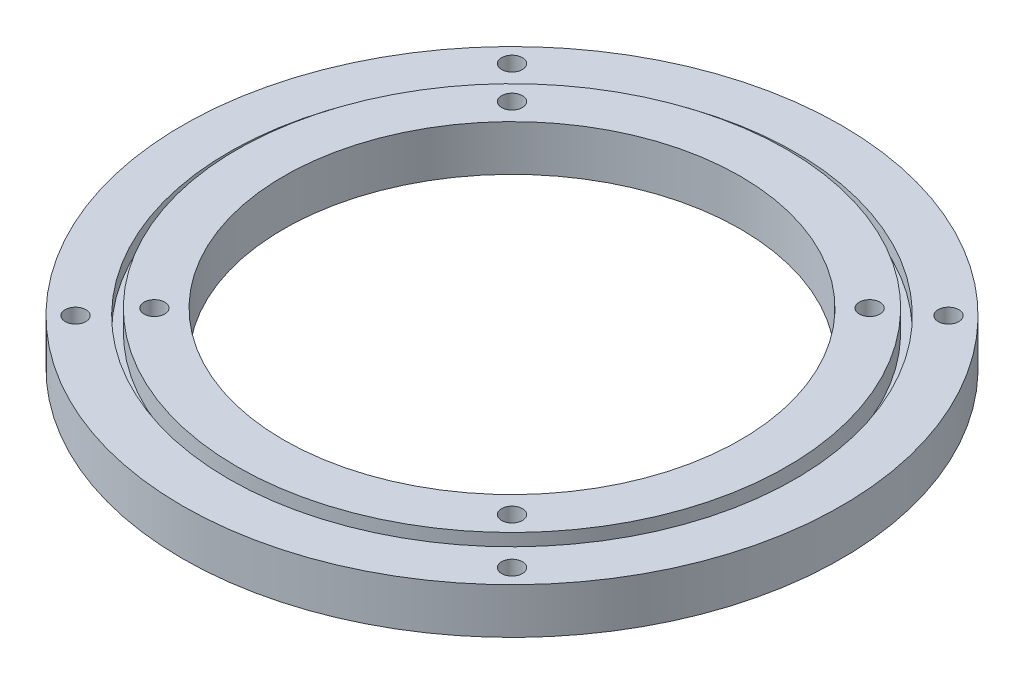
ISO-10303-21;
HEADER;
FILE_DESCRIPTION(('STEP AP214'),'2;1');
FILE_NAME('part.step','',(''),(''),'','','');
FILE_SCHEMA(('AUTOMOTIVE_DESIGN { 1 0 10303 214 1 1 1 1 }'));
ENDSEC;
DATA;
#1=APPLICATION_CONTEXT('core data for automotive mechanical design processes');
#2=APPLICATION_PROTOCOL_DEFINITION('international standard','automotive_design',2000,#1);
#3=PRODUCT_CONTEXT('',#1,'mechanical');
#4=PRODUCT('Part','Part','',(#3));
#5=PRODUCT_RELATED_PRODUCT_CATEGORY('part','',(#4));
#6=PRODUCT_DEFINITION_FORMATION('','',#4);
#7=PRODUCT_DEFINITION_CONTEXT('part definition',#1,'design');
#8=PRODUCT_DEFINITION('design','',#6,#7);
#9=PRODUCT_DEFINITION_SHAPE('','',#8);
#10=(LENGTH_UNIT() NAMED_UNIT(*) SI_UNIT(.MILLI.,.METRE.));
#11=(NAMED_UNIT(*) PLANE_ANGLE_UNIT() SI_UNIT($,.RADIAN.));
#12=(NAMED_UNIT(*) SI_UNIT($,.STERADIAN.) SOLID_ANGLE_UNIT());
#13=UNCERTAINTY_MEASURE_WITH_UNIT(LENGTH_MEASURE(1.E-05),#10,'distance_accuracy_value','');
#14=(GEOMETRIC_REPRESENTATION_CONTEXT(3) GLOBAL_UNCERTAINTY_ASSIGNED_CONTEXT((#13)) GLOBAL_UNIT_ASSIGNED_CONTEXT((#10,
#11,#12)) REPRESENTATION_CONTEXT('',''));
#15=CARTESIAN_POINT('',(0.,0.,0.));
#16=DIRECTION('',(0.,0.,1.));
#17=DIRECTION('',(1.,0.,0.));
#18=AXIS2_PLACEMENT_3D('',#15,#16,#17);
#19=CARTESIAN_POINT('',(0.,6.,0.));
#20=DIRECTION('',(0.,-1.,0.));
#21=DIRECTION('',(0.,0.,-1.));
#22=AXIS2_PLACEMENT_3D('',#19,#20,#21);
#23=CYLINDRICAL_SURFACE('',#22,86.77);
#24=CARTESIAN_POINT('',(0.,-1.5875,0.));
#25=DIRECTION('',(0.,1.,0.));
#26=DIRECTION('',(0.,0.,1.));
#27=AXIS2_PLACEMENT_3D('',#24,#25,#26);
#28=CIRCLE('',#27,86.77);
#29=CARTESIAN_POINT('',(0.,-1.5875,86.77));
#30=VERTEX_POINT('',#29);
#31=EDGE_CURVE('E177',#30,#30,#28,.T.);
#32=ORIENTED_EDGE('',*,*,#31,.T.);
#33=EDGE_LOOP('',(#32));
#34=FACE_BOUND('',#33,.T.);
#35=CARTESIAN_POINT('',(0.,-8.,0.));
#36=DIRECTION('',(0.,1.,0.));
#37=DIRECTION('',(0.,0.,1.));
#38=AXIS2_PLACEMENT_3D('',#35,#36,#37);
#39=CIRCLE('',#38,86.77);
#40=CARTESIAN_POINT('',(0.,-8.,86.77));
#41=VERTEX_POINT('',#40);
#42=EDGE_CURVE('E224',#41,#41,#39,.T.);
#43=ORIENTED_EDGE('',*,*,#42,.F.);
#44=EDGE_LOOP('',(#43));
#45=FACE_BOUND('',#44,.T.);
#46=ADVANCED_FACE('F147',(#34,#45),#23,.F.);
#47=CARTESIAN_POINT('',(66.8887659663411,6.,66.8887659663418));
#48=DIRECTION('',(0.,-1.,0.));
#49=DIRECTION('',(0.,0.,-1.));
#50=AXIS2_PLACEMENT_3D('',#47,#48,#49);
#51=CYLINDRICAL_SURFACE('',#50,3.175);
#52=CARTESIAN_POINT('',(66.8887659663411,6.,66.8887659663418));
#53=DIRECTION('',(0.,1.,0.));
#54=DIRECTION('',(0.,0.,1.));
#55=AXIS2_PLACEMENT_3D('',#52,#53,#54);
#56=CIRCLE('',#55,3.175);
#57=CARTESIAN_POINT('',(66.8887659663411,6.,70.0637659663418));
#58=VERTEX_POINT('',#57);
#59=EDGE_CURVE('E158',#58,#58,#56,.F.);
#60=ORIENTED_EDGE('',*,*,#59,.F.);
#61=EDGE_LOOP('',(#60));
#62=FACE_BOUND('',#61,.T.);
#63=CARTESIAN_POINT('',(66.8887659663411,-8.,66.8887659663418));
#64=DIRECTION('',(0.,1.,0.));
#65=DIRECTION('',(0.,0.,1.));
#66=AXIS2_PLACEMENT_3D('',#63,#64,#65);
#67=CIRCLE('',#66,3.175);
#68=CARTESIAN_POINT('',(66.8887659663411,-8.,70.0637659663418));
#69=VERTEX_POINT('',#68);
#70=EDGE_CURVE('E227',#69,#69,#67,.T.);
#71=ORIENTED_EDGE('',*,*,#70,.F.);
#72=EDGE_LOOP('',(#71));
#73=FACE_BOUND('',#72,.T.);
#74=ADVANCED_FACE('F259',(#62,#73),#51,.F.);
#75=CARTESIAN_POINT('',(0.,6.,0.));
#76=DIRECTION('',(0.,-1.,0.));
#77=DIRECTION('',(0.,0.,-1.));
#78=AXIS2_PLACEMENT_3D('',#75,#76,#77);
#79=CYLINDRICAL_SURFACE('',#78,101.);
#80=CARTESIAN_POINT('',(0.,6.,0.));
#81=DIRECTION('',(0.,1.,0.));
#82=DIRECTION('',(0.,0.,1.));
#83=AXIS2_PLACEMENT_3D('',#80,#81,#82);
#84=CIRCLE('',#83,101.);
#85=CARTESIAN_POINT('',(0.,6.,101.));
#86=VERTEX_POINT('',#85);
#87=EDGE_CURVE('E162',#86,#86,#84,.T.);
#88=ORIENTED_EDGE('',*,*,#87,.F.);
#89=EDGE_LOOP('',(#88));
#90=FACE_BOUND('',#89,.T.);
#91=CARTESIAN_POINT('',(0.,-8.,0.));
#92=DIRECTION('',(0.,1.,0.));
#93=DIRECTION('',(0.,0.,1.));
#94=AXIS2_PLACEMENT_3D('',#91,#92,#93);
#95=CIRCLE('',#94,101.);
#96=CARTESIAN_POINT('',(0.,-8.,101.));
#97=VERTEX_POINT('',#96);
#98=EDGE_CURVE('E221',#97,#97,#95,.T.);
#99=ORIENTED_EDGE('',*,*,#98,.T.);
#100=EDGE_LOOP('',(#99));
#101=FACE_BOUND('',#100,.T.);
#102=ADVANCED_FACE('F266',(#90,#101),#79,.T.);
#103=CARTESIAN_POINT('',(0.,1.5875,0.));
#104=DIRECTION('',(0.,1.,0.));
#105=DIRECTION('',(0.,0.,1.));
#106=AXIS2_PLACEMENT_3D('',#103,#104,#105);
#107=CIRCLE('',#106,86.77);
#108=CARTESIAN_POINT('',(0.,1.5875,86.77));
#109=VERTEX_POINT('',#108);
#110=EDGE_CURVE('E11',#109,#109,#107,.T.);
#111=ORIENTED_EDGE('',*,*,#110,.F.);
#112=EDGE_LOOP('',(#111));
#113=FACE_BOUND('',#112,.T.);
#114=CARTESIAN_POINT('',(0.,6.,0.));
#115=DIRECTION('',(0.,1.,0.));
#116=DIRECTION('',(0.,0.,1.));
#117=AXIS2_PLACEMENT_3D('',#114,#115,#116);
#118=CIRCLE('',#117,86.77);
#119=CARTESIAN_POINT('',(0.,6.,86.77));
#120=VERTEX_POINT('',#119);
#121=EDGE_CURVE('E167',#120,#120,#118,.T.);
#122=ORIENTED_EDGE('',*,*,#121,.T.);
#123=EDGE_LOOP('',(#122));
#124=FACE_BOUND('',#123,.T.);
#125=ADVANCED_FACE('F262',(#113,#124),#23,.F.);
#126=CARTESIAN_POINT('',(66.8887659663418,6.,-66.8887659663411));
#127=DIRECTION('',(0.,-1.,0.));
#128=DIRECTION('',(0.,0.,-1.));
#129=AXIS2_PLACEMENT_3D('',#126,#127,#128);
#130=CYLINDRICAL_SURFACE('',#129,3.175);
#131=CARTESIAN_POINT('',(66.8887659663418,6.,-66.8887659663411));
#132=DIRECTION('',(0.,1.,0.));
#133=DIRECTION('',(0.,0.,1.));
#134=AXIS2_PLACEMENT_3D('',#131,#132,#133);
#135=CIRCLE('',#134,3.175);
#136=CARTESIAN_POINT('',(66.8887659663418,6.,-63.7137659663411));
#137=VERTEX_POINT('',#136);
#138=EDGE_CURVE('E170',#137,#137,#135,.F.);
#139=ORIENTED_EDGE('',*,*,#138,.F.);
#140=EDGE_LOOP('',(#139));
#141=FACE_BOUND('',#140,.T.);
#142=CARTESIAN_POINT('',(66.8887659663418,-8.,-66.8887659663411));
#143=DIRECTION('',(0.,1.,0.));
#144=DIRECTION('',(0.,0.,1.));
#145=AXIS2_PLACEMENT_3D('',#142,#143,#144);
#146=CIRCLE('',#145,3.175);
#147=CARTESIAN_POINT('',(66.8887659663418,-8.,-63.7137659663411));
#148=VERTEX_POINT('',#147);
#149=EDGE_CURVE('E230',#148,#148,#146,.T.);
#150=ORIENTED_EDGE('',*,*,#149,.F.);
#151=EDGE_LOOP('',(#150));
#152=FACE_BOUND('',#151,.T.);
#153=ADVANCED_FACE('F255',(#141,#152),#130,.F.);
#154=CARTESIAN_POINT('',(-66.8887659663418,6.,66.8887659663411));
#155=DIRECTION('',(0.,-1.,0.));
#156=DIRECTION('',(0.,0.,-1.));
#157=AXIS2_PLACEMENT_3D('',#154,#155,#156);
#158=CYLINDRICAL_SURFACE('',#157,3.175);
#159=CARTESIAN_POINT('',(-66.8887659663418,6.,66.8887659663411));
#160=DIRECTION('',(0.,1.,0.));
#161=DIRECTION('',(0.,0.,1.));
#162=AXIS2_PLACEMENT_3D('',#159,#160,#161);
#163=CIRCLE('',#162,3.175);
#164=CARTESIAN_POINT('',(-66.8887659663418,6.,70.0637659663411));
#165=VERTEX_POINT('',#164);
#166=EDGE_CURVE('E173',#165,#165,#163,.F.);
#167=ORIENTED_EDGE('',*,*,#166,.F.);
#168=EDGE_LOOP('',(#167));
#169=FACE_BOUND('',#168,.T.);
#170=CARTESIAN_POINT('',(-66.8887659663418,-8.,66.8887659663411));
#171=DIRECTION('',(0.,1.,0.));
#172=DIRECTION('',(0.,0.,1.));
#173=AXIS2_PLACEMENT_3D('',#170,#171,#172);
#174=CIRCLE('',#173,3.175);
#175=CARTESIAN_POINT('',(-66.8887659663418,-8.,70.0637659663411));
#176=VERTEX_POINT('',#175);
#177=EDGE_CURVE('E233',#176,#176,#174,.T.);
#178=ORIENTED_EDGE('',*,*,#177,.F.);
#179=EDGE_LOOP('',(#178));
#180=FACE_BOUND('',#179,.T.);
#181=ADVANCED_FACE('F149',(#169,#180),#158,.F.);
#182=CARTESIAN_POINT('',(-66.8887659663411,6.,-66.8887659663418));
#183=DIRECTION('',(0.,-1.,0.));
#184=DIRECTION('',(0.,0.,-1.));
#185=AXIS2_PLACEMENT_3D('',#182,#183,#184);
#186=CYLINDRICAL_SURFACE('',#185,3.175);
#187=CARTESIAN_POINT('',(-66.8887659663411,6.,-66.8887659663418));
#188=DIRECTION('',(0.,1.,0.));
#189=DIRECTION('',(0.,0.,1.));
#190=AXIS2_PLACEMENT_3D('',#187,#188,#189);
#191=CIRCLE('',#190,3.175);
#192=CARTESIAN_POINT('',(-66.8887659663411,6.,-63.7137659663418));
#193=VERTEX_POINT('',#192);
#194=EDGE_CURVE('E154',#193,#193,#191,.F.);
#195=ORIENTED_EDGE('',*,*,#194,.F.);
#196=EDGE_LOOP('',(#195));
#197=FACE_BOUND('',#196,.T.);
#198=CARTESIAN_POINT('',(-66.8887659663411,-8.,-66.8887659663418));
#199=DIRECTION('',(0.,1.,0.));
#200=DIRECTION('',(0.,0.,1.));
#201=AXIS2_PLACEMENT_3D('',#198,#199,#200);
#202=CIRCLE('',#201,3.175);
#203=CARTESIAN_POINT('',(-66.8887659663411,-8.,-63.7137659663418));
#204=VERTEX_POINT('',#203);
#205=EDGE_CURVE('E236',#204,#204,#202,.T.);
#206=ORIENTED_EDGE('',*,*,#205,.F.);
#207=EDGE_LOOP('',(#206));
#208=FACE_BOUND('',#207,.T.);
#209=ADVANCED_FACE('F243',(#197,#208),#186,.F.);
#210=CARTESIAN_POINT('',(0.,6.,0.));
#211=DIRECTION('',(0.,1.,0.));
#212=DIRECTION('',(0.,0.,1.));
#213=AXIS2_PLACEMENT_3D('',#210,#211,#212);
#214=PLANE('',#213);
#215=ORIENTED_EDGE('',*,*,#166,.T.);
#216=EDGE_LOOP('',(#215));
#217=FACE_BOUND('',#216,.T.);
#218=ORIENTED_EDGE('',*,*,#138,.T.);
#219=EDGE_LOOP('',(#218));
#220=FACE_BOUND('',#219,.T.);
#221=ORIENTED_EDGE('',*,*,#121,.F.);
#222=EDGE_LOOP('',(#221));
#223=FACE_BOUND('',#222,.T.);
#224=ORIENTED_EDGE('',*,*,#87,.T.);
#225=EDGE_LOOP('',(#224));
#226=FACE_BOUND('',#225,.T.);
#227=ORIENTED_EDGE('',*,*,#59,.T.);
#228=EDGE_LOOP('',(#227));
#229=FACE_BOUND('',#228,.T.);
#230=ORIENTED_EDGE('',*,*,#194,.T.);
#231=EDGE_LOOP('',(#230));
#232=FACE_BOUND('',#231,.T.);
#233=ADVANCED_FACE('F245',(#217,#220,#223,#226,#229,#232),#214,.T.);
#234=CARTESIAN_POINT('',(0.,1.5875,0.));
#235=DIRECTION('',(0.,1.,0.));
#236=DIRECTION('',(0.,0.,1.));
#237=AXIS2_PLACEMENT_3D('',#234,#235,#236);
#238=PLANE('',#237);
#239=CARTESIAN_POINT('',(0.,1.5875,0.));
#240=DIRECTION('',(0.,1.,0.));
#241=DIRECTION('',(0.,0.,1.));
#242=AXIS2_PLACEMENT_3D('',#239,#240,#241);
#243=CIRCLE('',#242,84.23);
#244=CARTESIAN_POINT('',(0.,1.5875,84.23));
#245=VERTEX_POINT('',#244);
#246=EDGE_CURVE('E176',#245,#245,#243,.T.);
#247=ORIENTED_EDGE('',*,*,#246,.F.);
#248=EDGE_LOOP('',(#247));
#249=FACE_BOUND('',#248,.T.);
#250=ORIENTED_EDGE('',*,*,#110,.T.);
#251=EDGE_LOOP('',(#250));
#252=FACE_BOUND('',#251,.T.);
#253=ADVANCED_FACE('F252',(#249,#252),#238,.T.);
#254=CARTESIAN_POINT('',(0.,-1.5875,0.));
#255=DIRECTION('',(0.,1.,0.));
#256=DIRECTION('',(0.,0.,1.));
#257=AXIS2_PLACEMENT_3D('',#254,#255,#256);
#258=PLANE('',#257);
#259=CARTESIAN_POINT('',(0.,-1.5875,0.));
#260=DIRECTION('',(0.,1.,0.));
#261=DIRECTION('',(0.,0.,1.));
#262=AXIS2_PLACEMENT_3D('',#259,#260,#261);
#263=CIRCLE('',#262,84.23);
#264=CARTESIAN_POINT('',(0.,-1.5875,84.23));
#265=VERTEX_POINT('',#264);
#266=EDGE_CURVE('E180',#265,#265,#263,.F.);
#267=ORIENTED_EDGE('',*,*,#266,.F.);
#268=EDGE_LOOP('',(#267));
#269=FACE_BOUND('',#268,.T.);
#270=ORIENTED_EDGE('',*,*,#31,.F.);
#271=EDGE_LOOP('',(#270));
#272=FACE_BOUND('',#271,.T.);
#273=ADVANCED_FACE('F333',(#269,#272),#258,.F.);
#274=CARTESIAN_POINT('',(0.,6.,0.));
#275=DIRECTION('',(0.,-1.,0.));
#276=DIRECTION('',(0.,0.,-1.));
#277=AXIS2_PLACEMENT_3D('',#274,#275,#276);
#278=CYLINDRICAL_SURFACE('',#277,84.23);
#279=CARTESIAN_POINT('',(0.,-6.,0.));
#280=DIRECTION('',(0.,1.,0.));
#281=DIRECTION('',(0.,0.,1.));
#282=AXIS2_PLACEMENT_3D('',#279,#280,#281);
#283=CIRCLE('',#282,84.23);
#284=CARTESIAN_POINT('',(0.,-6.,84.23));
#285=VERTEX_POINT('',#284);
#286=EDGE_CURVE('E185',#285,#285,#283,.T.);
#287=ORIENTED_EDGE('',*,*,#286,.T.);
#288=EDGE_LOOP('',(#287));
#289=FACE_BOUND('',#288,.T.);
#290=ORIENTED_EDGE('',*,*,#266,.T.);
#291=EDGE_LOOP('',(#290));
#292=FACE_BOUND('',#291,.T.);
#293=ADVANCED_FACE('F311',(#289,#292),#278,.T.);
#294=CARTESIAN_POINT('',(0.,6.,0.));
#295=DIRECTION('',(0.,-1.,0.));
#296=DIRECTION('',(0.,0.,-1.));
#297=AXIS2_PLACEMENT_3D('',#294,#295,#296);
#298=CYLINDRICAL_SURFACE('',#297,70.);
#299=CARTESIAN_POINT('',(0.,-6.,0.));
#300=DIRECTION('',(0.,1.,0.));
#301=DIRECTION('',(0.,0.,1.));
#302=AXIS2_PLACEMENT_3D('',#299,#300,#301);
#303=CIRCLE('',#302,70.);
#304=CARTESIAN_POINT('',(0.,-6.,70.));
#305=VERTEX_POINT('',#304);
#306=EDGE_CURVE('E188',#305,#305,#303,.T.);
#307=ORIENTED_EDGE('',*,*,#306,.F.);
#308=EDGE_LOOP('',(#307));
#309=FACE_BOUND('',#308,.T.);
#310=CARTESIAN_POINT('',(0.,8.,0.));
#311=DIRECTION('',(0.,1.,0.));
#312=DIRECTION('',(0.,0.,1.));
#313=AXIS2_PLACEMENT_3D('',#310,#311,#312);
#314=CIRCLE('',#313,70.);
#315=CARTESIAN_POINT('',(0.,8.,70.));
#316=VERTEX_POINT('',#315);
#317=EDGE_CURVE('E206',#316,#316,#314,.T.);
#318=ORIENTED_EDGE('',*,*,#317,.T.);
#319=EDGE_LOOP('',(#318));
#320=FACE_BOUND('',#319,.T.);
#321=ADVANCED_FACE('F312',(#309,#320),#298,.F.);
#322=CARTESIAN_POINT('',(54.8007755419577,6.,-54.8007755419572));
#323=DIRECTION('',(0.,-1.,0.));
#324=DIRECTION('',(0.,0.,-1.));
#325=AXIS2_PLACEMENT_3D('',#322,#323,#324);
#326=CYLINDRICAL_SURFACE('',#325,3.175);
#327=CARTESIAN_POINT('',(54.8007755419577,-6.,-54.8007755419572));
#328=DIRECTION('',(0.,1.,0.));
#329=DIRECTION('',(0.,0.,1.));
#330=AXIS2_PLACEMENT_3D('',#327,#328,#329);
#331=CIRCLE('',#330,3.175);
#332=CARTESIAN_POINT('',(54.8007755419577,-6.,-51.6257755419572));
#333=VERTEX_POINT('',#332);
#334=EDGE_CURVE('E191',#333,#333,#331,.T.);
#335=ORIENTED_EDGE('',*,*,#334,.F.);
#336=EDGE_LOOP('',(#335));
#337=FACE_BOUND('',#336,.T.);
#338=CARTESIAN_POINT('',(54.8007755419577,8.,-54.8007755419572));
#339=DIRECTION('',(0.,1.,0.));
#340=DIRECTION('',(0.,0.,1.));
#341=AXIS2_PLACEMENT_3D('',#338,#339,#340);
#342=CIRCLE('',#341,3.175);
#343=CARTESIAN_POINT('',(54.8007755419577,8.,-51.6257755419572));
#344=VERTEX_POINT('',#343);
#345=EDGE_CURVE('E209',#344,#344,#342,.T.);
#346=ORIENTED_EDGE('',*,*,#345,.T.);
#347=EDGE_LOOP('',(#346));
#348=FACE_BOUND('',#347,.T.);
#349=ADVANCED_FACE('F315',(#337,#348),#326,.F.);
#350=CARTESIAN_POINT('',(54.8007755419572,6.,54.8007755419577));
#351=DIRECTION('',(0.,-1.,0.));
#352=DIRECTION('',(0.,0.,-1.));
#353=AXIS2_PLACEMENT_3D('',#350,#351,#352);
#354=CYLINDRICAL_SURFACE('',#353,3.17499999999999);
#355=CARTESIAN_POINT('',(54.8007755419572,-6.,54.8007755419577));
#356=DIRECTION('',(0.,1.,0.));
#357=DIRECTION('',(0.,0.,1.));
#358=AXIS2_PLACEMENT_3D('',#355,#356,#357);
#359=CIRCLE('',#358,3.17499999999999);
#360=CARTESIAN_POINT('',(54.8007755419572,-6.,57.9757755419577));
#361=VERTEX_POINT('',#360);
#362=EDGE_CURVE('E194',#361,#361,#359,.T.);
#363=ORIENTED_EDGE('',*,*,#362,.F.);
#364=EDGE_LOOP('',(#363));
#365=FACE_BOUND('',#364,.T.);
#366=CARTESIAN_POINT('',(54.8007755419572,8.,54.8007755419577));
#367=DIRECTION('',(0.,1.,0.));
#368=DIRECTION('',(0.,0.,1.));
#369=AXIS2_PLACEMENT_3D('',#366,#367,#368);
#370=CIRCLE('',#369,3.17499999999999);
#371=CARTESIAN_POINT('',(54.8007755419572,8.,57.9757755419577));
#372=VERTEX_POINT('',#371);
#373=EDGE_CURVE('E212',#372,#372,#370,.T.);
#374=ORIENTED_EDGE('',*,*,#373,.T.);
#375=EDGE_LOOP('',(#374));
#376=FACE_BOUND('',#375,.T.);
#377=ADVANCED_FACE('F319',(#365,#376),#354,.F.);
#378=CARTESIAN_POINT('',(-54.8007755419577,6.,54.8007755419572));
#379=DIRECTION('',(0.,-1.,0.));
#380=DIRECTION('',(0.,0.,-1.));
#381=AXIS2_PLACEMENT_3D('',#378,#379,#380);
#382=CYLINDRICAL_SURFACE('',#381,3.175);
#383=CARTESIAN_POINT('',(-54.8007755419577,-6.,54.8007755419572));
#384=DIRECTION('',(0.,1.,0.));
#385=DIRECTION('',(0.,0.,1.));
#386=AXIS2_PLACEMENT_3D('',#383,#384,#385);
#387=CIRCLE('',#386,3.175);
#388=CARTESIAN_POINT('',(-54.8007755419577,-6.,57.9757755419572));
#389=VERTEX_POINT('',#388);
#390=EDGE_CURVE('E197',#389,#389,#387,.T.);
#391=ORIENTED_EDGE('',*,*,#390,.F.);
#392=EDGE_LOOP('',(#391));
#393=FACE_BOUND('',#392,.T.);
#394=CARTESIAN_POINT('',(-54.8007755419577,8.,54.8007755419572));
#395=DIRECTION('',(0.,1.,0.));
#396=DIRECTION('',(0.,0.,1.));
#397=AXIS2_PLACEMENT_3D('',#394,#395,#396);
#398=CIRCLE('',#397,3.175);
#399=CARTESIAN_POINT('',(-54.8007755419577,8.,57.9757755419572));
#400=VERTEX_POINT('',#399);
#401=EDGE_CURVE('E215',#400,#400,#398,.T.);
#402=ORIENTED_EDGE('',*,*,#401,.T.);
#403=EDGE_LOOP('',(#402));
#404=FACE_BOUND('',#403,.T.);
#405=ADVANCED_FACE('F323',(#393,#404),#382,.F.);
#406=CARTESIAN_POINT('',(-54.8007755419572,6.,-54.8007755419577));
#407=DIRECTION('',(0.,-1.,0.));
#408=DIRECTION('',(0.,0.,-1.));
#409=AXIS2_PLACEMENT_3D('',#406,#407,#408);
#410=CYLINDRICAL_SURFACE('',#409,3.175);
#411=CARTESIAN_POINT('',(-54.8007755419572,-6.,-54.8007755419577));
#412=DIRECTION('',(0.,1.,0.));
#413=DIRECTION('',(0.,0.,1.));
#414=AXIS2_PLACEMENT_3D('',#411,#412,#413);
#415=CIRCLE('',#414,3.175);
#416=CARTESIAN_POINT('',(-54.8007755419572,-6.,-51.6257755419577));
#417=VERTEX_POINT('',#416);
#418=EDGE_CURVE('E200',#417,#417,#415,.T.);
#419=ORIENTED_EDGE('',*,*,#418,.F.);
#420=EDGE_LOOP('',(#419));
#421=FACE_BOUND('',#420,.T.);
#422=CARTESIAN_POINT('',(-54.8007755419572,8.,-54.8007755419577));
#423=DIRECTION('',(0.,1.,0.));
#424=DIRECTION('',(0.,0.,1.));
#425=AXIS2_PLACEMENT_3D('',#422,#423,#424);
#426=CIRCLE('',#425,3.175);
#427=CARTESIAN_POINT('',(-54.8007755419572,8.,-51.6257755419577));
#428=VERTEX_POINT('',#427);
#429=EDGE_CURVE('E218',#428,#428,#426,.T.);
#430=ORIENTED_EDGE('',*,*,#429,.T.);
#431=EDGE_LOOP('',(#430));
#432=FACE_BOUND('',#431,.T.);
#433=ADVANCED_FACE('F309',(#421,#432),#410,.F.);
#434=ORIENTED_EDGE('',*,*,#246,.T.);
#435=EDGE_LOOP('',(#434));
#436=FACE_BOUND('',#435,.T.);
#437=CARTESIAN_POINT('',(0.,8.,0.));
#438=DIRECTION('',(0.,1.,0.));
#439=DIRECTION('',(0.,0.,1.));
#440=AXIS2_PLACEMENT_3D('',#437,#438,#439);
#441=CIRCLE('',#440,84.23);
#442=CARTESIAN_POINT('',(0.,8.,84.23));
#443=VERTEX_POINT('',#442);
#444=EDGE_CURVE('E203',#443,#443,#441,.T.);
#445=ORIENTED_EDGE('',*,*,#444,.F.);
#446=EDGE_LOOP('',(#445));
#447=FACE_BOUND('',#446,.T.);
#448=ADVANCED_FACE('F305',(#436,#447),#278,.T.);
#449=CARTESIAN_POINT('',(0.,-6.,0.));
#450=DIRECTION('',(0.,1.,0.));
#451=DIRECTION('',(0.,0.,1.));
#452=AXIS2_PLACEMENT_3D('',#449,#450,#451);
#453=PLANE('',#452);
#454=ORIENTED_EDGE('',*,*,#418,.T.);
#455=EDGE_LOOP('',(#454));
#456=FACE_BOUND('',#455,.T.);
#457=ORIENTED_EDGE('',*,*,#390,.T.);
#458=EDGE_LOOP('',(#457));
#459=FACE_BOUND('',#458,.T.);
#460=ORIENTED_EDGE('',*,*,#362,.T.);
#461=EDGE_LOOP('',(#460));
#462=FACE_BOUND('',#461,.T.);
#463=ORIENTED_EDGE('',*,*,#334,.T.);
#464=EDGE_LOOP('',(#463));
#465=FACE_BOUND('',#464,.T.);
#466=ORIENTED_EDGE('',*,*,#306,.T.);
#467=EDGE_LOOP('',(#466));
#468=FACE_BOUND('',#467,.T.);
#469=ORIENTED_EDGE('',*,*,#286,.F.);
#470=EDGE_LOOP('',(#469));
#471=FACE_BOUND('',#470,.T.);
#472=ADVANCED_FACE('F299',(#456,#459,#462,#465,#468,#471),#453,.F.);
#473=CARTESIAN_POINT('',(0.,8.,0.));
#474=DIRECTION('',(0.,1.,0.));
#475=DIRECTION('',(0.,0.,1.));
#476=AXIS2_PLACEMENT_3D('',#473,#474,#475);
#477=PLANE('',#476);
#478=ORIENTED_EDGE('',*,*,#401,.F.);
#479=EDGE_LOOP('',(#478));
#480=FACE_BOUND('',#479,.T.);
#481=ORIENTED_EDGE('',*,*,#345,.F.);
#482=EDGE_LOOP('',(#481));
#483=FACE_BOUND('',#482,.T.);
#484=ORIENTED_EDGE('',*,*,#444,.T.);
#485=EDGE_LOOP('',(#484));
#486=FACE_BOUND('',#485,.T.);
#487=ORIENTED_EDGE('',*,*,#317,.F.);
#488=EDGE_LOOP('',(#487));
#489=FACE_BOUND('',#488,.T.);
#490=ORIENTED_EDGE('',*,*,#373,.F.);
#491=EDGE_LOOP('',(#490));
#492=FACE_BOUND('',#491,.T.);
#493=ORIENTED_EDGE('',*,*,#429,.F.);
#494=EDGE_LOOP('',(#493));
#495=FACE_BOUND('',#494,.T.);
#496=ADVANCED_FACE('F290',(#480,#483,#486,#489,#492,#495),#477,.T.);
#497=CARTESIAN_POINT('',(0.,-8.,0.));
#498=DIRECTION('',(0.,1.,0.));
#499=DIRECTION('',(0.,0.,1.));
#500=AXIS2_PLACEMENT_3D('',#497,#498,#499);
#501=PLANE('',#500);
#502=ORIENTED_EDGE('',*,*,#205,.T.);
#503=EDGE_LOOP('',(#502));
#504=FACE_BOUND('',#503,.T.);
#505=ORIENTED_EDGE('',*,*,#177,.T.);
#506=EDGE_LOOP('',(#505));
#507=FACE_BOUND('',#506,.T.);
#508=ORIENTED_EDGE('',*,*,#149,.T.);
#509=EDGE_LOOP('',(#508));
#510=FACE_BOUND('',#509,.T.);
#511=ORIENTED_EDGE('',*,*,#70,.T.);
#512=EDGE_LOOP('',(#511));
#513=FACE_BOUND('',#512,.T.);
#514=ORIENTED_EDGE('',*,*,#42,.T.);
#515=EDGE_LOOP('',(#514));
#516=FACE_BOUND('',#515,.T.);
#517=ORIENTED_EDGE('',*,*,#98,.F.);
#518=EDGE_LOOP('',(#517));
#519=FACE_BOUND('',#518,.T.);
#520=ADVANCED_FACE('F240',(#504,#507,#510,#513,#516,#519),#501,.F.);
#521=CLOSED_SHELL('',(#46,#74,#102,#125,#153,#181,#209,#233,#253,#273,#293,#321,#349,#377,#405,
#433,#448,#472,#496,#520));
#522=MANIFOLD_SOLID_BREP('B2',#521);
#523=ADVANCED_BREP_SHAPE_REPRESENTATION('',(#18,#522),#14);
#524=SHAPE_DEFINITION_REPRESENTATION(#9,#523);
ENDSEC;
END-ISO-10303-21;
